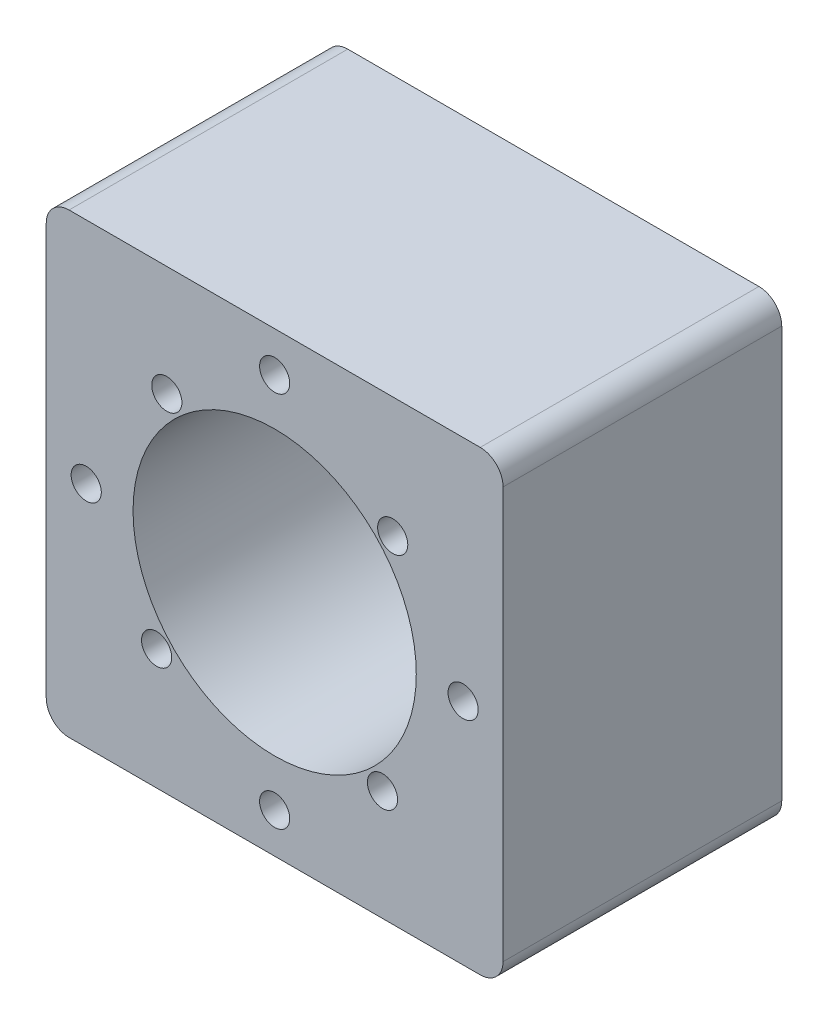
ISO-10303-21;
HEADER;
FILE_DESCRIPTION(('STEP AP214'),'2;1');
FILE_NAME('part.step','',(''),(''),'','','');
FILE_SCHEMA(('AUTOMOTIVE_DESIGN { 1 0 10303 214 1 1 1 1 }'));
ENDSEC;
DATA;
#1=APPLICATION_CONTEXT('core data for automotive mechanical design processes');
#2=APPLICATION_PROTOCOL_DEFINITION('international standard','automotive_design',2000,#1);
#3=PRODUCT_CONTEXT('',#1,'mechanical');
#4=PRODUCT('Part','Part','',(#3));
#5=PRODUCT_RELATED_PRODUCT_CATEGORY('part','',(#4));
#6=PRODUCT_DEFINITION_FORMATION('','',#4);
#7=PRODUCT_DEFINITION_CONTEXT('part definition',#1,'design');
#8=PRODUCT_DEFINITION('design','',#6,#7);
#9=PRODUCT_DEFINITION_SHAPE('','',#8);
#10=(LENGTH_UNIT() NAMED_UNIT(*) SI_UNIT(.MILLI.,.METRE.));
#11=(NAMED_UNIT(*) PLANE_ANGLE_UNIT() SI_UNIT($,.RADIAN.));
#12=(NAMED_UNIT(*) SI_UNIT($,.STERADIAN.) SOLID_ANGLE_UNIT());
#13=UNCERTAINTY_MEASURE_WITH_UNIT(LENGTH_MEASURE(1.E-05),#10,'distance_accuracy_value','');
#14=(GEOMETRIC_REPRESENTATION_CONTEXT(3) GLOBAL_UNCERTAINTY_ASSIGNED_CONTEXT((#13)) GLOBAL_UNIT_ASSIGNED_CONTEXT((#10,
#11,#12)) REPRESENTATION_CONTEXT('',''));
#15=CARTESIAN_POINT('',(0.,0.,0.));
#16=DIRECTION('',(0.,0.,1.));
#17=DIRECTION('',(1.,0.,0.));
#18=AXIS2_PLACEMENT_3D('',#15,#16,#17);
#19=CARTESIAN_POINT('',(0.,0.,7.));
#20=DIRECTION('',(0.,0.,-1.));
#21=DIRECTION('',(-1.,0.,0.));
#22=AXIS2_PLACEMENT_3D('',#19,#20,#21);
#23=CYLINDRICAL_SURFACE('',#22,25.);
#24=CARTESIAN_POINT('',(0.,0.,7.));
#25=DIRECTION('',(0.,0.,-1.));
#26=DIRECTION('',(-1.,0.,0.));
#27=AXIS2_PLACEMENT_3D('',#24,#25,#26);
#28=CIRCLE('',#27,25.);
#29=CARTESIAN_POINT('',(-25.,0.,7.));
#30=VERTEX_POINT('',#29);
#31=EDGE_CURVE('E190',#30,#30,#28,.T.);
#32=ORIENTED_EDGE('',*,*,#31,.F.);
#33=EDGE_LOOP('',(#32));
#34=FACE_BOUND('',#33,.T.);
#35=CARTESIAN_POINT('',(0.,0.,3.));
#36=DIRECTION('',(0.,0.,-1.));
#37=DIRECTION('',(-1.,0.,0.));
#38=AXIS2_PLACEMENT_3D('',#35,#36,#37);
#39=CIRCLE('',#38,25.);
#40=CARTESIAN_POINT('',(-25.,0.,3.));
#41=VERTEX_POINT('',#40);
#42=EDGE_CURVE('E89',#41,#41,#39,.F.);
#43=ORIENTED_EDGE('',*,*,#42,.F.);
#44=EDGE_LOOP('',(#43));
#45=FACE_BOUND('',#44,.T.);
#46=ADVANCED_FACE('F85',(#34,#45),#23,.F.);
#47=CARTESIAN_POINT('',(0.,0.,72.));
#48=DIRECTION('',(0.,0.,-1.));
#49=DIRECTION('',(-1.,0.,0.));
#50=AXIS2_PLACEMENT_3D('',#47,#48,#49);
#51=CYLINDRICAL_SURFACE('',#50,31.);
#52=CARTESIAN_POINT('',(0.,0.,61.));
#53=DIRECTION('',(0.,0.,1.));
#54=DIRECTION('',(1.,0.,0.));
#55=AXIS2_PLACEMENT_3D('',#52,#53,#54);
#56=CIRCLE('',#55,31.);
#57=CARTESIAN_POINT('',(31.,0.,61.));
#58=VERTEX_POINT('',#57);
#59=EDGE_CURVE('E94',#58,#58,#56,.T.);
#60=ORIENTED_EDGE('',*,*,#59,.T.);
#61=EDGE_LOOP('',(#60));
#62=FACE_BOUND('',#61,.T.);
#63=CARTESIAN_POINT('',(0.,0.,7.00000000000001));
#64=DIRECTION('',(0.,0.,-1.));
#65=DIRECTION('',(-1.,0.,0.));
#66=AXIS2_PLACEMENT_3D('',#63,#64,#65);
#67=CIRCLE('',#66,31.);
#68=CARTESIAN_POINT('',(-31.,0.,7.00000000000001));
#69=VERTEX_POINT('',#68);
#70=EDGE_CURVE('E13',#69,#69,#67,.F.);
#71=ORIENTED_EDGE('',*,*,#70,.F.);
#72=EDGE_LOOP('',(#71));
#73=FACE_BOUND('',#72,.T.);
#74=ADVANCED_FACE('F310',(#62,#73),#51,.F.);
#75=CARTESIAN_POINT('',(0.,0.,61.));
#76=DIRECTION('',(0.,0.,1.));
#77=DIRECTION('',(1.,0.,0.));
#78=AXIS2_PLACEMENT_3D('',#75,#76,#77);
#79=PLANE('',#78);
#80=CARTESIAN_POINT('',(-23.6085930044774,25.8386210225883,61.));
#81=DIRECTION('',(0.,0.,1.));
#82=DIRECTION('',(1.,0.,0.));
#83=AXIS2_PLACEMENT_3D('',#80,#81,#82);
#84=CIRCLE('',#83,3.29999999999999);
#85=CARTESIAN_POINT('',(-20.3085930044774,25.8386210225883,61.));
#86=VERTEX_POINT('',#85);
#87=EDGE_CURVE('E229',#86,#86,#84,.T.);
#88=ORIENTED_EDGE('',*,*,#87,.F.);
#89=EDGE_LOOP('',(#88));
#90=FACE_BOUND('',#89,.T.);
#91=CARTESIAN_POINT('',(-25.8386210225883,-23.6085930044774,61.));
#92=DIRECTION('',(0.,0.,1.));
#93=DIRECTION('',(1.,0.,0.));
#94=AXIS2_PLACEMENT_3D('',#91,#92,#93);
#95=CIRCLE('',#94,3.29999999999999);
#96=CARTESIAN_POINT('',(-22.5386210225883,-23.6085930044774,61.));
#97=VERTEX_POINT('',#96);
#98=EDGE_CURVE('E241',#97,#97,#95,.T.);
#99=ORIENTED_EDGE('',*,*,#98,.F.);
#100=EDGE_LOOP('',(#99));
#101=FACE_BOUND('',#100,.T.);
#102=CARTESIAN_POINT('',(23.6085930044774,-25.8386210225883,61.));
#103=DIRECTION('',(0.,0.,1.));
#104=DIRECTION('',(1.,0.,0.));
#105=AXIS2_PLACEMENT_3D('',#102,#103,#104);
#106=CIRCLE('',#105,3.29999999999999);
#107=CARTESIAN_POINT('',(26.9085930044774,-25.8386210225883,61.));
#108=VERTEX_POINT('',#107);
#109=EDGE_CURVE('E247',#108,#108,#106,.T.);
#110=ORIENTED_EDGE('',*,*,#109,.F.);
#111=EDGE_LOOP('',(#110));
#112=FACE_BOUND('',#111,.T.);
#113=CARTESIAN_POINT('',(25.8386210225883,23.6085930044774,61.));
#114=DIRECTION('',(0.,0.,1.));
#115=DIRECTION('',(1.,0.,0.));
#116=AXIS2_PLACEMENT_3D('',#113,#114,#115);
#117=CIRCLE('',#116,3.29999999999999);
#118=CARTESIAN_POINT('',(29.1386210225883,23.6085930044774,61.));
#119=VERTEX_POINT('',#118);
#120=EDGE_CURVE('E253',#119,#119,#117,.T.);
#121=ORIENTED_EDGE('',*,*,#120,.F.);
#122=EDGE_LOOP('',(#121));
#123=FACE_BOUND('',#122,.T.);
#124=CARTESIAN_POINT('',(-41.25,0.,61.));
#125=DIRECTION('',(0.,0.,-1.));
#126=DIRECTION('',(-1.,0.,0.));
#127=AXIS2_PLACEMENT_3D('',#124,#125,#126);
#128=CIRCLE('',#127,3.29999999999998);
#129=CARTESIAN_POINT('',(-44.55,0.,61.));
#130=VERTEX_POINT('',#129);
#131=EDGE_CURVE('E268',#130,#130,#128,.T.);
#132=ORIENTED_EDGE('',*,*,#131,.T.);
#133=EDGE_LOOP('',(#132));
#134=FACE_BOUND('',#133,.T.);
#135=CARTESIAN_POINT('',(0.,41.25,61.));
#136=DIRECTION('',(0.,0.,-1.));
#137=DIRECTION('',(-1.,0.,0.));
#138=AXIS2_PLACEMENT_3D('',#135,#136,#137);
#139=CIRCLE('',#138,3.29999999999998);
#140=CARTESIAN_POINT('',(-3.29999999999998,41.25,61.));
#141=VERTEX_POINT('',#140);
#142=EDGE_CURVE('E280',#141,#141,#139,.T.);
#143=ORIENTED_EDGE('',*,*,#142,.T.);
#144=EDGE_LOOP('',(#143));
#145=FACE_BOUND('',#144,.T.);
#146=CARTESIAN_POINT('',(41.25,0.,61.));
#147=DIRECTION('',(0.,0.,-1.));
#148=DIRECTION('',(-1.,0.,0.));
#149=AXIS2_PLACEMENT_3D('',#146,#147,#148);
#150=CIRCLE('',#149,3.29999999999998);
#151=CARTESIAN_POINT('',(37.95,0.,61.));
#152=VERTEX_POINT('',#151);
#153=EDGE_CURVE('E292',#152,#152,#150,.T.);
#154=ORIENTED_EDGE('',*,*,#153,.T.);
#155=EDGE_LOOP('',(#154));
#156=FACE_BOUND('',#155,.T.);
#157=CARTESIAN_POINT('',(0.,-41.25,61.));
#158=DIRECTION('',(0.,0.,-1.));
#159=DIRECTION('',(-1.,0.,0.));
#160=AXIS2_PLACEMENT_3D('',#157,#158,#159);
#161=CIRCLE('',#160,3.29999999999998);
#162=CARTESIAN_POINT('',(-3.29999999999998,-41.25,61.));
#163=VERTEX_POINT('',#162);
#164=EDGE_CURVE('E304',#163,#163,#161,.T.);
#165=ORIENTED_EDGE('',*,*,#164,.T.);
#166=EDGE_LOOP('',(#165));
#167=FACE_BOUND('',#166,.T.);
#168=ORIENTED_EDGE('',*,*,#59,.F.);
#169=EDGE_LOOP('',(#168));
#170=FACE_BOUND('',#169,.T.);
#171=DIRECTION('',(-1.,0.,0.));
#172=VECTOR('',#171,1.);
#173=CARTESIAN_POINT('',(0.,50.,61.));
#174=LINE('',#173,#172);
#175=CARTESIAN_POINT('',(45.,50.,61.));
#176=VERTEX_POINT('',#175);
#177=CARTESIAN_POINT('',(-45.,50.,61.));
#178=VERTEX_POINT('',#177);
#179=EDGE_CURVE('E227',#176,#178,#174,.T.);
#180=ORIENTED_EDGE('',*,*,#179,.T.);
#181=CARTESIAN_POINT('',(-45.,45.,61.));
#182=DIRECTION('',(0.,0.,1.));
#183=DIRECTION('',(1.,0.,0.));
#184=AXIS2_PLACEMENT_3D('',#181,#182,#183);
#185=CIRCLE('',#184,5.);
#186=CARTESIAN_POINT('',(-50.,45.,61.));
#187=VERTEX_POINT('',#186);
#188=EDGE_CURVE('E214',#187,#178,#185,.F.);
#189=ORIENTED_EDGE('',*,*,#188,.F.);
#190=DIRECTION('',(0.,1.,0.));
#191=VECTOR('',#190,1.);
#192=CARTESIAN_POINT('',(-50.,0.,61.));
#193=LINE('',#192,#191);
#194=CARTESIAN_POINT('',(-50.,-45.,61.));
#195=VERTEX_POINT('',#194);
#196=EDGE_CURVE('E210',#195,#187,#193,.T.);
#197=ORIENTED_EDGE('',*,*,#196,.F.);
#198=CARTESIAN_POINT('',(-45.,-45.,61.));
#199=DIRECTION('',(0.,0.,1.));
#200=DIRECTION('',(1.,0.,0.));
#201=AXIS2_PLACEMENT_3D('',#198,#199,#200);
#202=CIRCLE('',#201,5.);
#203=CARTESIAN_POINT('',(-45.,-50.,61.));
#204=VERTEX_POINT('',#203);
#205=EDGE_CURVE('E200',#204,#195,#202,.F.);
#206=ORIENTED_EDGE('',*,*,#205,.F.);
#207=DIRECTION('',(-1.,0.,0.));
#208=VECTOR('',#207,1.);
#209=CARTESIAN_POINT('',(0.,-50.,61.));
#210=LINE('',#209,#208);
#211=CARTESIAN_POINT('',(45.,-50.,61.));
#212=VERTEX_POINT('',#211);
#213=EDGE_CURVE('E196',#212,#204,#210,.T.);
#214=ORIENTED_EDGE('',*,*,#213,.F.);
#215=CARTESIAN_POINT('',(45.,-45.,61.));
#216=DIRECTION('',(0.,0.,1.));
#217=DIRECTION('',(1.,0.,0.));
#218=AXIS2_PLACEMENT_3D('',#215,#216,#217);
#219=CIRCLE('',#218,5.);
#220=CARTESIAN_POINT('',(50.,-45.,61.));
#221=VERTEX_POINT('',#220);
#222=EDGE_CURVE('E178',#212,#221,#219,.T.);
#223=ORIENTED_EDGE('',*,*,#222,.T.);
#224=DIRECTION('',(0.,1.,0.));
#225=VECTOR('',#224,1.);
#226=CARTESIAN_POINT('',(50.,0.,61.));
#227=LINE('',#226,#225);
#228=CARTESIAN_POINT('',(50.,45.,61.));
#229=VERTEX_POINT('',#228);
#230=EDGE_CURVE('E167',#221,#229,#227,.T.);
#231=ORIENTED_EDGE('',*,*,#230,.T.);
#232=CARTESIAN_POINT('',(45.,45.,61.));
#233=DIRECTION('',(0.,0.,1.));
#234=DIRECTION('',(1.,0.,0.));
#235=AXIS2_PLACEMENT_3D('',#232,#233,#234);
#236=CIRCLE('',#235,5.);
#237=EDGE_CURVE('E230',#229,#176,#236,.T.);
#238=ORIENTED_EDGE('',*,*,#237,.T.);
#239=EDGE_LOOP('',(#180,#189,#197,#206,#214,#223,#231,#238));
#240=FACE_BOUND('',#239,.T.);
#241=ADVANCED_FACE('F313',(#90,#101,#112,#123,#134,#145,#156,#167,#170,#240),#79,.T.);
#242=CARTESIAN_POINT('',(0.,0.,0.));
#243=DIRECTION('',(0.,0.,1.));
#244=DIRECTION('',(1.,0.,0.));
#245=AXIS2_PLACEMENT_3D('',#242,#243,#244);
#246=PLANE('',#245);
#247=CARTESIAN_POINT('',(0.,0.,0.));
#248=DIRECTION('',(0.,0.,-1.));
#249=DIRECTION('',(-1.,0.,0.));
#250=AXIS2_PLACEMENT_3D('',#247,#248,#249);
#251=CIRCLE('',#250,31.);
#252=CARTESIAN_POINT('',(-31.,0.,0.));
#253=VERTEX_POINT('',#252);
#254=EDGE_CURVE('E758',#253,#253,#251,.T.);
#255=ORIENTED_EDGE('',*,*,#254,.F.);
#256=EDGE_LOOP('',(#255));
#257=FACE_BOUND('',#256,.T.);
#258=CARTESIAN_POINT('',(-41.25,0.,0.));
#259=DIRECTION('',(0.,0.,-1.));
#260=DIRECTION('',(-1.,0.,0.));
#261=AXIS2_PLACEMENT_3D('',#258,#259,#260);
#262=CIRCLE('',#261,6.5);
#263=CARTESIAN_POINT('',(-47.75,0.,0.));
#264=VERTEX_POINT('',#263);
#265=EDGE_CURVE('E259',#264,#264,#262,.T.);
#266=ORIENTED_EDGE('',*,*,#265,.F.);
#267=EDGE_LOOP('',(#266));
#268=FACE_BOUND('',#267,.T.);
#269=CARTESIAN_POINT('',(0.,41.25,0.));
#270=DIRECTION('',(0.,0.,-1.));
#271=DIRECTION('',(-1.,0.,0.));
#272=AXIS2_PLACEMENT_3D('',#269,#270,#271);
#273=CIRCLE('',#272,6.5);
#274=CARTESIAN_POINT('',(-6.5,41.25,0.));
#275=VERTEX_POINT('',#274);
#276=EDGE_CURVE('E271',#275,#275,#273,.T.);
#277=ORIENTED_EDGE('',*,*,#276,.F.);
#278=EDGE_LOOP('',(#277));
#279=FACE_BOUND('',#278,.T.);
#280=CARTESIAN_POINT('',(41.25,0.,0.));
#281=DIRECTION('',(0.,0.,-1.));
#282=DIRECTION('',(-1.,0.,0.));
#283=AXIS2_PLACEMENT_3D('',#280,#281,#282);
#284=CIRCLE('',#283,6.5);
#285=CARTESIAN_POINT('',(34.75,0.,0.));
#286=VERTEX_POINT('',#285);
#287=EDGE_CURVE('E283',#286,#286,#284,.T.);
#288=ORIENTED_EDGE('',*,*,#287,.F.);
#289=EDGE_LOOP('',(#288));
#290=FACE_BOUND('',#289,.T.);
#291=CARTESIAN_POINT('',(0.,-41.25,0.));
#292=DIRECTION('',(0.,0.,-1.));
#293=DIRECTION('',(-1.,0.,0.));
#294=AXIS2_PLACEMENT_3D('',#291,#292,#293);
#295=CIRCLE('',#294,6.5);
#296=CARTESIAN_POINT('',(-6.5,-41.25,0.));
#297=VERTEX_POINT('',#296);
#298=EDGE_CURVE('E295',#297,#297,#295,.T.);
#299=ORIENTED_EDGE('',*,*,#298,.F.);
#300=EDGE_LOOP('',(#299));
#301=FACE_BOUND('',#300,.T.);
#302=DIRECTION('',(0.,1.,0.));
#303=VECTOR('',#302,1.);
#304=CARTESIAN_POINT('',(50.,0.,0.));
#305=LINE('',#304,#303);
#306=CARTESIAN_POINT('',(50.,-45.,0.));
#307=VERTEX_POINT('',#306);
#308=CARTESIAN_POINT('',(50.,45.,0.));
#309=VERTEX_POINT('',#308);
#310=EDGE_CURVE('E158',#307,#309,#305,.T.);
#311=ORIENTED_EDGE('',*,*,#310,.F.);
#312=CARTESIAN_POINT('',(45.,-45.,0.));
#313=DIRECTION('',(0.,0.,-1.));
#314=DIRECTION('',(-1.,0.,0.));
#315=AXIS2_PLACEMENT_3D('',#312,#313,#314);
#316=CIRCLE('',#315,5.);
#317=CARTESIAN_POINT('',(45.,-50.,0.));
#318=VERTEX_POINT('',#317);
#319=EDGE_CURVE('E162',#318,#307,#316,.F.);
#320=ORIENTED_EDGE('',*,*,#319,.F.);
#321=DIRECTION('',(-1.,0.,0.));
#322=VECTOR('',#321,1.);
#323=CARTESIAN_POINT('',(0.,-50.,0.));
#324=LINE('',#323,#322);
#325=CARTESIAN_POINT('',(-45.,-50.,0.));
#326=VERTEX_POINT('',#325);
#327=EDGE_CURVE('E183',#318,#326,#324,.T.);
#328=ORIENTED_EDGE('',*,*,#327,.T.);
#329=CARTESIAN_POINT('',(-45.,-45.,0.));
#330=DIRECTION('',(0.,0.,-1.));
#331=DIRECTION('',(-1.,0.,0.));
#332=AXIS2_PLACEMENT_3D('',#329,#330,#331);
#333=CIRCLE('',#332,5.);
#334=CARTESIAN_POINT('',(-50.,-45.,0.));
#335=VERTEX_POINT('',#334);
#336=EDGE_CURVE('E185',#326,#335,#333,.T.);
#337=ORIENTED_EDGE('',*,*,#336,.T.);
#338=DIRECTION('',(0.,1.,0.));
#339=VECTOR('',#338,1.);
#340=CARTESIAN_POINT('',(-50.,0.,0.));
#341=LINE('',#340,#339);
#342=CARTESIAN_POINT('',(-50.,45.,0.));
#343=VERTEX_POINT('',#342);
#344=EDGE_CURVE('E195',#335,#343,#341,.T.);
#345=ORIENTED_EDGE('',*,*,#344,.T.);
#346=CARTESIAN_POINT('',(-45.,45.,0.));
#347=DIRECTION('',(0.,0.,-1.));
#348=DIRECTION('',(-1.,0.,0.));
#349=AXIS2_PLACEMENT_3D('',#346,#347,#348);
#350=CIRCLE('',#349,5.);
#351=CARTESIAN_POINT('',(-45.,50.,0.));
#352=VERTEX_POINT('',#351);
#353=EDGE_CURVE('E219',#343,#352,#350,.T.);
#354=ORIENTED_EDGE('',*,*,#353,.T.);
#355=DIRECTION('',(-1.,0.,0.));
#356=VECTOR('',#355,1.);
#357=CARTESIAN_POINT('',(0.,50.,0.));
#358=LINE('',#357,#356);
#359=CARTESIAN_POINT('',(45.,50.,0.));
#360=VERTEX_POINT('',#359);
#361=EDGE_CURVE('E168',#360,#352,#358,.T.);
#362=ORIENTED_EDGE('',*,*,#361,.F.);
#363=CARTESIAN_POINT('',(45.,45.,0.));
#364=DIRECTION('',(0.,0.,-1.));
#365=DIRECTION('',(-1.,0.,0.));
#366=AXIS2_PLACEMENT_3D('',#363,#364,#365);
#367=CIRCLE('',#366,5.);
#368=EDGE_CURVE('E165',#309,#360,#367,.F.);
#369=ORIENTED_EDGE('',*,*,#368,.F.);
#370=EDGE_LOOP('',(#311,#320,#328,#337,#345,#354,#362,#369));
#371=FACE_BOUND('',#370,.T.);
#372=ADVANCED_FACE('F87',(#257,#268,#279,#290,#301,#371),#246,.F.);
#373=CARTESIAN_POINT('',(0.,-41.25,0.));
#374=DIRECTION('',(0.,0.,-1.));
#375=DIRECTION('',(-1.,0.,0.));
#376=AXIS2_PLACEMENT_3D('',#373,#374,#375);
#377=CYLINDRICAL_SURFACE('',#376,3.29999999999999);
#378=ORIENTED_EDGE('',*,*,#164,.F.);
#379=EDGE_LOOP('',(#378));
#380=FACE_BOUND('',#379,.T.);
#381=CARTESIAN_POINT('',(0.,-41.25,4.6));
#382=DIRECTION('',(0.,0.,-1.));
#383=DIRECTION('',(-1.,0.,0.));
#384=AXIS2_PLACEMENT_3D('',#381,#382,#383);
#385=CIRCLE('',#384,3.3);
#386=CARTESIAN_POINT('',(-3.3,-41.25,4.6));
#387=VERTEX_POINT('',#386);
#388=EDGE_CURVE('E301',#387,#387,#385,.T.);
#389=ORIENTED_EDGE('',*,*,#388,.T.);
#390=EDGE_LOOP('',(#389));
#391=FACE_BOUND('',#390,.T.);
#392=ADVANCED_FACE('F437',(#380,#391),#377,.F.);
#393=CARTESIAN_POINT('',(3.3,-41.25,4.6));
#394=DIRECTION('',(0.,0.,1.));
#395=DIRECTION('',(1.,0.,0.));
#396=AXIS2_PLACEMENT_3D('',#393,#394,#395);
#397=PLANE('',#396);
#398=ORIENTED_EDGE('',*,*,#388,.F.);
#399=EDGE_LOOP('',(#398));
#400=FACE_BOUND('',#399,.T.);
#401=CARTESIAN_POINT('',(0.,-41.25,4.6));
#402=DIRECTION('',(0.,0.,-1.));
#403=DIRECTION('',(-1.,0.,0.));
#404=AXIS2_PLACEMENT_3D('',#401,#402,#403);
#405=CIRCLE('',#404,6.5);
#406=CARTESIAN_POINT('',(-6.5,-41.25,4.6));
#407=VERTEX_POINT('',#406);
#408=EDGE_CURVE('E298',#407,#407,#405,.T.);
#409=ORIENTED_EDGE('',*,*,#408,.T.);
#410=EDGE_LOOP('',(#409));
#411=FACE_BOUND('',#410,.T.);
#412=ADVANCED_FACE('F656',(#400,#411),#397,.F.);
#413=CARTESIAN_POINT('',(0.,-41.25,0.));
#414=DIRECTION('',(0.,0.,-1.));
#415=DIRECTION('',(-1.,0.,0.));
#416=AXIS2_PLACEMENT_3D('',#413,#414,#415);
#417=CYLINDRICAL_SURFACE('',#416,6.5);
#418=ORIENTED_EDGE('',*,*,#408,.F.);
#419=EDGE_LOOP('',(#418));
#420=FACE_BOUND('',#419,.T.);
#421=ORIENTED_EDGE('',*,*,#298,.T.);
#422=EDGE_LOOP('',(#421));
#423=FACE_BOUND('',#422,.T.);
#424=ADVANCED_FACE('F646',(#420,#423),#417,.F.);
#425=CARTESIAN_POINT('',(41.25,0.,0.));
#426=DIRECTION('',(0.,0.,-1.));
#427=DIRECTION('',(-1.,0.,0.));
#428=AXIS2_PLACEMENT_3D('',#425,#426,#427);
#429=CYLINDRICAL_SURFACE('',#428,3.29999999999999);
#430=ORIENTED_EDGE('',*,*,#153,.F.);
#431=EDGE_LOOP('',(#430));
#432=FACE_BOUND('',#431,.T.);
#433=CARTESIAN_POINT('',(41.25,0.,4.6));
#434=DIRECTION('',(0.,0.,-1.));
#435=DIRECTION('',(-1.,0.,0.));
#436=AXIS2_PLACEMENT_3D('',#433,#434,#435);
#437=CIRCLE('',#436,3.3);
#438=CARTESIAN_POINT('',(37.95,0.,4.6));
#439=VERTEX_POINT('',#438);
#440=EDGE_CURVE('E289',#439,#439,#437,.T.);
#441=ORIENTED_EDGE('',*,*,#440,.T.);
#442=EDGE_LOOP('',(#441));
#443=FACE_BOUND('',#442,.T.);
#444=ADVANCED_FACE('F636',(#432,#443),#429,.F.);
#445=CARTESIAN_POINT('',(44.55,0.,4.6));
#446=DIRECTION('',(0.,0.,1.));
#447=DIRECTION('',(1.,0.,0.));
#448=AXIS2_PLACEMENT_3D('',#445,#446,#447);
#449=PLANE('',#448);
#450=ORIENTED_EDGE('',*,*,#440,.F.);
#451=EDGE_LOOP('',(#450));
#452=FACE_BOUND('',#451,.T.);
#453=CARTESIAN_POINT('',(41.25,0.,4.6));
#454=DIRECTION('',(0.,0.,-1.));
#455=DIRECTION('',(-1.,0.,0.));
#456=AXIS2_PLACEMENT_3D('',#453,#454,#455);
#457=CIRCLE('',#456,6.5);
#458=CARTESIAN_POINT('',(34.75,0.,4.6));
#459=VERTEX_POINT('',#458);
#460=EDGE_CURVE('E286',#459,#459,#457,.T.);
#461=ORIENTED_EDGE('',*,*,#460,.T.);
#462=EDGE_LOOP('',(#461));
#463=FACE_BOUND('',#462,.T.);
#464=ADVANCED_FACE('F626',(#452,#463),#449,.F.);
#465=CARTESIAN_POINT('',(41.25,0.,0.));
#466=DIRECTION('',(0.,0.,-1.));
#467=DIRECTION('',(-1.,0.,0.));
#468=AXIS2_PLACEMENT_3D('',#465,#466,#467);
#469=CYLINDRICAL_SURFACE('',#468,6.5);
#470=ORIENTED_EDGE('',*,*,#460,.F.);
#471=EDGE_LOOP('',(#470));
#472=FACE_BOUND('',#471,.T.);
#473=ORIENTED_EDGE('',*,*,#287,.T.);
#474=EDGE_LOOP('',(#473));
#475=FACE_BOUND('',#474,.T.);
#476=ADVANCED_FACE('F616',(#472,#475),#469,.F.);
#477=CARTESIAN_POINT('',(0.,41.25,0.));
#478=DIRECTION('',(0.,0.,-1.));
#479=DIRECTION('',(-1.,0.,0.));
#480=AXIS2_PLACEMENT_3D('',#477,#478,#479);
#481=CYLINDRICAL_SURFACE('',#480,3.29999999999999);
#482=ORIENTED_EDGE('',*,*,#142,.F.);
#483=EDGE_LOOP('',(#482));
#484=FACE_BOUND('',#483,.T.);
#485=CARTESIAN_POINT('',(0.,41.25,4.6));
#486=DIRECTION('',(0.,0.,-1.));
#487=DIRECTION('',(-1.,0.,0.));
#488=AXIS2_PLACEMENT_3D('',#485,#486,#487);
#489=CIRCLE('',#488,3.3);
#490=CARTESIAN_POINT('',(-3.3,41.25,4.6));
#491=VERTEX_POINT('',#490);
#492=EDGE_CURVE('E277',#491,#491,#489,.T.);
#493=ORIENTED_EDGE('',*,*,#492,.T.);
#494=EDGE_LOOP('',(#493));
#495=FACE_BOUND('',#494,.T.);
#496=ADVANCED_FACE('F606',(#484,#495),#481,.F.);
#497=CARTESIAN_POINT('',(3.3,41.25,4.6));
#498=DIRECTION('',(0.,0.,1.));
#499=DIRECTION('',(1.,0.,0.));
#500=AXIS2_PLACEMENT_3D('',#497,#498,#499);
#501=PLANE('',#500);
#502=ORIENTED_EDGE('',*,*,#492,.F.);
#503=EDGE_LOOP('',(#502));
#504=FACE_BOUND('',#503,.T.);
#505=CARTESIAN_POINT('',(0.,41.25,4.6));
#506=DIRECTION('',(0.,0.,-1.));
#507=DIRECTION('',(-1.,0.,0.));
#508=AXIS2_PLACEMENT_3D('',#505,#506,#507);
#509=CIRCLE('',#508,6.5);
#510=CARTESIAN_POINT('',(-6.5,41.25,4.6));
#511=VERTEX_POINT('',#510);
#512=EDGE_CURVE('E274',#511,#511,#509,.T.);
#513=ORIENTED_EDGE('',*,*,#512,.T.);
#514=EDGE_LOOP('',(#513));
#515=FACE_BOUND('',#514,.T.);
#516=ADVANCED_FACE('F596',(#504,#515),#501,.F.);
#517=CARTESIAN_POINT('',(0.,41.25,0.));
#518=DIRECTION('',(0.,0.,-1.));
#519=DIRECTION('',(-1.,0.,0.));
#520=AXIS2_PLACEMENT_3D('',#517,#518,#519);
#521=CYLINDRICAL_SURFACE('',#520,6.5);
#522=ORIENTED_EDGE('',*,*,#512,.F.);
#523=EDGE_LOOP('',(#522));
#524=FACE_BOUND('',#523,.T.);
#525=ORIENTED_EDGE('',*,*,#276,.T.);
#526=EDGE_LOOP('',(#525));
#527=FACE_BOUND('',#526,.T.);
#528=ADVANCED_FACE('F586',(#524,#527),#521,.F.);
#529=CARTESIAN_POINT('',(-41.25,0.,0.));
#530=DIRECTION('',(0.,0.,-1.));
#531=DIRECTION('',(-1.,0.,0.));
#532=AXIS2_PLACEMENT_3D('',#529,#530,#531);
#533=CYLINDRICAL_SURFACE('',#532,3.29999999999999);
#534=ORIENTED_EDGE('',*,*,#131,.F.);
#535=EDGE_LOOP('',(#534));
#536=FACE_BOUND('',#535,.T.);
#537=CARTESIAN_POINT('',(-41.25,0.,4.6));
#538=DIRECTION('',(0.,0.,-1.));
#539=DIRECTION('',(-1.,0.,0.));
#540=AXIS2_PLACEMENT_3D('',#537,#538,#539);
#541=CIRCLE('',#540,3.3);
#542=CARTESIAN_POINT('',(-44.55,0.,4.6));
#543=VERTEX_POINT('',#542);
#544=EDGE_CURVE('E265',#543,#543,#541,.T.);
#545=ORIENTED_EDGE('',*,*,#544,.T.);
#546=EDGE_LOOP('',(#545));
#547=FACE_BOUND('',#546,.T.);
#548=ADVANCED_FACE('F576',(#536,#547),#533,.F.);
#549=CARTESIAN_POINT('',(-37.95,0.,4.6));
#550=DIRECTION('',(0.,0.,1.));
#551=DIRECTION('',(1.,0.,0.));
#552=AXIS2_PLACEMENT_3D('',#549,#550,#551);
#553=PLANE('',#552);
#554=ORIENTED_EDGE('',*,*,#544,.F.);
#555=EDGE_LOOP('',(#554));
#556=FACE_BOUND('',#555,.T.);
#557=CARTESIAN_POINT('',(-41.25,0.,4.6));
#558=DIRECTION('',(0.,0.,-1.));
#559=DIRECTION('',(-1.,0.,0.));
#560=AXIS2_PLACEMENT_3D('',#557,#558,#559);
#561=CIRCLE('',#560,6.5);
#562=CARTESIAN_POINT('',(-47.75,0.,4.6));
#563=VERTEX_POINT('',#562);
#564=EDGE_CURVE('E262',#563,#563,#561,.T.);
#565=ORIENTED_EDGE('',*,*,#564,.T.);
#566=EDGE_LOOP('',(#565));
#567=FACE_BOUND('',#566,.T.);
#568=ADVANCED_FACE('F566',(#556,#567),#553,.F.);
#569=CARTESIAN_POINT('',(-41.25,0.,0.));
#570=DIRECTION('',(0.,0.,-1.));
#571=DIRECTION('',(-1.,0.,0.));
#572=AXIS2_PLACEMENT_3D('',#569,#570,#571);
#573=CYLINDRICAL_SURFACE('',#572,6.5);
#574=ORIENTED_EDGE('',*,*,#564,.F.);
#575=EDGE_LOOP('',(#574));
#576=FACE_BOUND('',#575,.T.);
#577=ORIENTED_EDGE('',*,*,#265,.T.);
#578=EDGE_LOOP('',(#577));
#579=FACE_BOUND('',#578,.T.);
#580=ADVANCED_FACE('F557',(#576,#579),#573,.F.);
#581=CARTESIAN_POINT('',(25.8386210225883,23.6085930044774,56.));
#582=DIRECTION('',(0.,0.,1.));
#583=DIRECTION('',(1.,0.,0.));
#584=AXIS2_PLACEMENT_3D('',#581,#582,#583);
#585=CONICAL_SURFACE('',#584,3.29999999999999,1.0471975511966);
#586=CARTESIAN_POINT('',(25.8386210225883,23.6085930044774,54.0947441116742));
#587=VERTEX_POINT('',#586);
#588=VERTEX_LOOP('',#587);
#589=FACE_BOUND('',#588,.T.);
#590=CARTESIAN_POINT('',(25.8386210225883,23.6085930044774,56.));
#591=DIRECTION('',(0.,0.,1.));
#592=DIRECTION('',(1.,0.,0.));
#593=AXIS2_PLACEMENT_3D('',#590,#591,#592);
#594=CIRCLE('',#593,3.29999999999999);
#595=CARTESIAN_POINT('',(29.1386210225883,23.6085930044774,56.));
#596=VERTEX_POINT('',#595);
#597=EDGE_CURVE('E256',#596,#596,#594,.T.);
#598=ORIENTED_EDGE('',*,*,#597,.T.);
#599=EDGE_LOOP('',(#598));
#600=FACE_BOUND('',#599,.T.);
#601=ADVANCED_FACE('F547',(#589,#600),#585,.F.);
#602=CARTESIAN_POINT('',(25.8386210225883,23.6085930044774,61.));
#603=DIRECTION('',(0.,0.,1.));
#604=DIRECTION('',(1.,0.,0.));
#605=AXIS2_PLACEMENT_3D('',#602,#603,#604);
#606=CYLINDRICAL_SURFACE('',#605,3.29999999999999);
#607=ORIENTED_EDGE('',*,*,#597,.F.);
#608=EDGE_LOOP('',(#607));
#609=FACE_BOUND('',#608,.T.);
#610=ORIENTED_EDGE('',*,*,#120,.T.);
#611=EDGE_LOOP('',(#610));
#612=FACE_BOUND('',#611,.T.);
#613=ADVANCED_FACE('F538',(#609,#612),#606,.F.);
#614=CARTESIAN_POINT('',(23.6085930044774,-25.8386210225883,56.));
#615=DIRECTION('',(0.,0.,1.));
#616=DIRECTION('',(1.,0.,0.));
#617=AXIS2_PLACEMENT_3D('',#614,#615,#616);
#618=CONICAL_SURFACE('',#617,3.29999999999999,1.0471975511966);
#619=CARTESIAN_POINT('',(23.6085930044774,-25.8386210225883,54.0947441116742));
#620=VERTEX_POINT('',#619);
#621=VERTEX_LOOP('',#620);
#622=FACE_BOUND('',#621,.T.);
#623=CARTESIAN_POINT('',(23.6085930044774,-25.8386210225883,56.));
#624=DIRECTION('',(0.,0.,1.));
#625=DIRECTION('',(1.,0.,0.));
#626=AXIS2_PLACEMENT_3D('',#623,#624,#625);
#627=CIRCLE('',#626,3.29999999999999);
#628=CARTESIAN_POINT('',(26.9085930044774,-25.8386210225883,56.));
#629=VERTEX_POINT('',#628);
#630=EDGE_CURVE('E250',#629,#629,#627,.T.);
#631=ORIENTED_EDGE('',*,*,#630,.T.);
#632=EDGE_LOOP('',(#631));
#633=FACE_BOUND('',#632,.T.);
#634=ADVANCED_FACE('F528',(#622,#633),#618,.F.);
#635=CARTESIAN_POINT('',(23.6085930044774,-25.8386210225883,61.));
#636=DIRECTION('',(0.,0.,1.));
#637=DIRECTION('',(1.,0.,0.));
#638=AXIS2_PLACEMENT_3D('',#635,#636,#637);
#639=CYLINDRICAL_SURFACE('',#638,3.29999999999999);
#640=ORIENTED_EDGE('',*,*,#630,.F.);
#641=EDGE_LOOP('',(#640));
#642=FACE_BOUND('',#641,.T.);
#643=ORIENTED_EDGE('',*,*,#109,.T.);
#644=EDGE_LOOP('',(#643));
#645=FACE_BOUND('',#644,.T.);
#646=ADVANCED_FACE('F518',(#642,#645),#639,.F.);
#647=CARTESIAN_POINT('',(-25.8386210225883,-23.6085930044774,56.));
#648=DIRECTION('',(0.,0.,1.));
#649=DIRECTION('',(1.,0.,0.));
#650=AXIS2_PLACEMENT_3D('',#647,#648,#649);
#651=CONICAL_SURFACE('',#650,3.29999999999999,1.0471975511966);
#652=CARTESIAN_POINT('',(-25.8386210225883,-23.6085930044774,54.0947441116742));
#653=VERTEX_POINT('',#652);
#654=VERTEX_LOOP('',#653);
#655=FACE_BOUND('',#654,.T.);
#656=CARTESIAN_POINT('',(-25.8386210225883,-23.6085930044774,56.));
#657=DIRECTION('',(0.,0.,1.));
#658=DIRECTION('',(1.,0.,0.));
#659=AXIS2_PLACEMENT_3D('',#656,#657,#658);
#660=CIRCLE('',#659,3.29999999999999);
#661=CARTESIAN_POINT('',(-22.5386210225883,-23.6085930044774,56.));
#662=VERTEX_POINT('',#661);
#663=EDGE_CURVE('E244',#662,#662,#660,.T.);
#664=ORIENTED_EDGE('',*,*,#663,.T.);
#665=EDGE_LOOP('',(#664));
#666=FACE_BOUND('',#665,.T.);
#667=ADVANCED_FACE('F508',(#655,#666),#651,.F.);
#668=CARTESIAN_POINT('',(-25.8386210225883,-23.6085930044774,61.));
#669=DIRECTION('',(0.,0.,1.));
#670=DIRECTION('',(1.,0.,0.));
#671=AXIS2_PLACEMENT_3D('',#668,#669,#670);
#672=CYLINDRICAL_SURFACE('',#671,3.29999999999999);
#673=ORIENTED_EDGE('',*,*,#663,.F.);
#674=EDGE_LOOP('',(#673));
#675=FACE_BOUND('',#674,.T.);
#676=ORIENTED_EDGE('',*,*,#98,.T.);
#677=EDGE_LOOP('',(#676));
#678=FACE_BOUND('',#677,.T.);
#679=ADVANCED_FACE('F498',(#675,#678),#672,.F.);
#680=CARTESIAN_POINT('',(-23.6085930044774,25.8386210225883,56.));
#681=DIRECTION('',(0.,0.,1.));
#682=DIRECTION('',(1.,0.,0.));
#683=AXIS2_PLACEMENT_3D('',#680,#681,#682);
#684=CONICAL_SURFACE('',#683,3.29999999999999,1.0471975511966);
#685=CARTESIAN_POINT('',(-23.6085930044774,25.8386210225883,54.0947441116742));
#686=VERTEX_POINT('',#685);
#687=VERTEX_LOOP('',#686);
#688=FACE_BOUND('',#687,.T.);
#689=CARTESIAN_POINT('',(-23.6085930044774,25.8386210225883,56.));
#690=DIRECTION('',(0.,0.,1.));
#691=DIRECTION('',(1.,0.,0.));
#692=AXIS2_PLACEMENT_3D('',#689,#690,#691);
#693=CIRCLE('',#692,3.29999999999999);
#694=CARTESIAN_POINT('',(-20.3085930044774,25.8386210225883,56.));
#695=VERTEX_POINT('',#694);
#696=EDGE_CURVE('E238',#695,#695,#693,.T.);
#697=ORIENTED_EDGE('',*,*,#696,.T.);
#698=EDGE_LOOP('',(#697));
#699=FACE_BOUND('',#698,.T.);
#700=ADVANCED_FACE('F345',(#688,#699),#684,.F.);
#701=CARTESIAN_POINT('',(-23.6085930044774,25.8386210225883,61.));
#702=DIRECTION('',(0.,0.,1.));
#703=DIRECTION('',(1.,0.,0.));
#704=AXIS2_PLACEMENT_3D('',#701,#702,#703);
#705=CYLINDRICAL_SURFACE('',#704,3.29999999999999);
#706=ORIENTED_EDGE('',*,*,#696,.F.);
#707=EDGE_LOOP('',(#706));
#708=FACE_BOUND('',#707,.T.);
#709=ORIENTED_EDGE('',*,*,#87,.T.);
#710=EDGE_LOOP('',(#709));
#711=FACE_BOUND('',#710,.T.);
#712=ADVANCED_FACE('F338',(#708,#711),#705,.F.);
#713=CARTESIAN_POINT('',(45.,45.,192.710678118655));
#714=DIRECTION('',(0.,0.,-1.));
#715=DIRECTION('',(-1.,0.,0.));
#716=AXIS2_PLACEMENT_3D('',#713,#714,#715);
#717=CYLINDRICAL_SURFACE('',#716,5.);
#718=ORIENTED_EDGE('',*,*,#237,.F.);
#719=DIRECTION('',(0.,0.,-1.));
#720=VECTOR('',#719,1.);
#721=CARTESIAN_POINT('',(50.,45.,192.710678118655));
#722=LINE('',#721,#720);
#723=EDGE_CURVE('E209',#229,#309,#722,.T.);
#724=ORIENTED_EDGE('',*,*,#723,.T.);
#725=ORIENTED_EDGE('',*,*,#368,.T.);
#726=DIRECTION('',(0.,0.,-1.));
#727=VECTOR('',#726,1.);
#728=CARTESIAN_POINT('',(45.,50.,192.710678118655));
#729=LINE('',#728,#727);
#730=EDGE_CURVE('E224',#176,#360,#729,.T.);
#731=ORIENTED_EDGE('',*,*,#730,.F.);
#732=EDGE_LOOP('',(#718,#724,#725,#731));
#733=FACE_BOUND('',#732,.T.);
#734=ADVANCED_FACE('F336',(#733),#717,.T.);
#735=CARTESIAN_POINT('',(0.,50.,192.710678118655));
#736=DIRECTION('',(0.,-1.,0.));
#737=DIRECTION('',(0.,0.,-1.));
#738=AXIS2_PLACEMENT_3D('',#735,#736,#737);
#739=PLANE('',#738);
#740=ORIENTED_EDGE('',*,*,#179,.F.);
#741=ORIENTED_EDGE('',*,*,#730,.T.);
#742=ORIENTED_EDGE('',*,*,#361,.T.);
#743=DIRECTION('',(0.,0.,-1.));
#744=VECTOR('',#743,1.);
#745=CARTESIAN_POINT('',(-45.,50.,192.710678118655));
#746=LINE('',#745,#744);
#747=EDGE_CURVE('E211',#178,#352,#746,.T.);
#748=ORIENTED_EDGE('',*,*,#747,.F.);
#749=EDGE_LOOP('',(#740,#741,#742,#748));
#750=FACE_BOUND('',#749,.T.);
#751=ADVANCED_FACE('F321',(#750),#739,.F.);
#752=CARTESIAN_POINT('',(50.,0.,192.710678118655));
#753=DIRECTION('',(-1.,0.,0.));
#754=DIRECTION('',(0.,0.,1.));
#755=AXIS2_PLACEMENT_3D('',#752,#753,#754);
#756=PLANE('',#755);
#757=ORIENTED_EDGE('',*,*,#230,.F.);
#758=DIRECTION('',(0.,0.,-1.));
#759=VECTOR('',#758,1.);
#760=CARTESIAN_POINT('',(50.,-45.,192.710678118655));
#761=LINE('',#760,#759);
#762=EDGE_CURVE('E171',#221,#307,#761,.T.);
#763=ORIENTED_EDGE('',*,*,#762,.T.);
#764=ORIENTED_EDGE('',*,*,#310,.T.);
#765=ORIENTED_EDGE('',*,*,#723,.F.);
#766=EDGE_LOOP('',(#757,#763,#764,#765));
#767=FACE_BOUND('',#766,.T.);
#768=ADVANCED_FACE('F172',(#767),#756,.F.);
#769=CARTESIAN_POINT('',(-45.,45.,192.710678118655));
#770=DIRECTION('',(0.,0.,-1.));
#771=DIRECTION('',(-1.,0.,0.));
#772=AXIS2_PLACEMENT_3D('',#769,#770,#771);
#773=CYLINDRICAL_SURFACE('',#772,5.);
#774=DIRECTION('',(0.,0.,-1.));
#775=VECTOR('',#774,1.);
#776=CARTESIAN_POINT('',(-50.,45.,192.710678118655));
#777=LINE('',#776,#775);
#778=EDGE_CURVE('E207',#187,#343,#777,.T.);
#779=ORIENTED_EDGE('',*,*,#778,.F.);
#780=ORIENTED_EDGE('',*,*,#188,.T.);
#781=ORIENTED_EDGE('',*,*,#747,.T.);
#782=ORIENTED_EDGE('',*,*,#353,.F.);
#783=EDGE_LOOP('',(#779,#780,#781,#782));
#784=FACE_BOUND('',#783,.T.);
#785=ADVANCED_FACE('F325',(#784),#773,.T.);
#786=CARTESIAN_POINT('',(-50.,0.,192.710678118655));
#787=DIRECTION('',(-1.,0.,0.));
#788=DIRECTION('',(0.,0.,1.));
#789=AXIS2_PLACEMENT_3D('',#786,#787,#788);
#790=PLANE('',#789);
#791=ORIENTED_EDGE('',*,*,#344,.F.);
#792=DIRECTION('',(0.,0.,-1.));
#793=VECTOR('',#792,1.);
#794=CARTESIAN_POINT('',(-50.,-45.,192.710678118655));
#795=LINE('',#794,#793);
#796=EDGE_CURVE('E197',#195,#335,#795,.T.);
#797=ORIENTED_EDGE('',*,*,#796,.F.);
#798=ORIENTED_EDGE('',*,*,#196,.T.);
#799=ORIENTED_EDGE('',*,*,#778,.T.);
#800=EDGE_LOOP('',(#791,#797,#798,#799));
#801=FACE_BOUND('',#800,.T.);
#802=ADVANCED_FACE('F327',(#801),#790,.T.);
#803=CARTESIAN_POINT('',(-45.,-45.,192.710678118655));
#804=DIRECTION('',(0.,0.,-1.));
#805=DIRECTION('',(-1.,0.,0.));
#806=AXIS2_PLACEMENT_3D('',#803,#804,#805);
#807=CYLINDRICAL_SURFACE('',#806,5.);
#808=DIRECTION('',(0.,0.,-1.));
#809=VECTOR('',#808,1.);
#810=CARTESIAN_POINT('',(-45.,-50.,192.710678118655));
#811=LINE('',#810,#809);
#812=EDGE_CURVE('E193',#204,#326,#811,.T.);
#813=ORIENTED_EDGE('',*,*,#812,.F.);
#814=ORIENTED_EDGE('',*,*,#205,.T.);
#815=ORIENTED_EDGE('',*,*,#796,.T.);
#816=ORIENTED_EDGE('',*,*,#336,.F.);
#817=EDGE_LOOP('',(#813,#814,#815,#816));
#818=FACE_BOUND('',#817,.T.);
#819=ADVANCED_FACE('F334',(#818),#807,.T.);
#820=CARTESIAN_POINT('',(0.,-50.,192.710678118655));
#821=DIRECTION('',(0.,-1.,0.));
#822=DIRECTION('',(0.,0.,-1.));
#823=AXIS2_PLACEMENT_3D('',#820,#821,#822);
#824=PLANE('',#823);
#825=ORIENTED_EDGE('',*,*,#327,.F.);
#826=DIRECTION('',(0.,0.,-1.));
#827=VECTOR('',#826,1.);
#828=CARTESIAN_POINT('',(45.,-50.,192.710678118655));
#829=LINE('',#828,#827);
#830=EDGE_CURVE('E177',#212,#318,#829,.T.);
#831=ORIENTED_EDGE('',*,*,#830,.F.);
#832=ORIENTED_EDGE('',*,*,#213,.T.);
#833=ORIENTED_EDGE('',*,*,#812,.T.);
#834=EDGE_LOOP('',(#825,#831,#832,#833));
#835=FACE_BOUND('',#834,.T.);
#836=ADVANCED_FACE('F332',(#835),#824,.T.);
#837=CARTESIAN_POINT('',(45.,-45.,192.710678118655));
#838=DIRECTION('',(0.,0.,-1.));
#839=DIRECTION('',(-1.,0.,0.));
#840=AXIS2_PLACEMENT_3D('',#837,#838,#839);
#841=CYLINDRICAL_SURFACE('',#840,5.);
#842=ORIENTED_EDGE('',*,*,#222,.F.);
#843=ORIENTED_EDGE('',*,*,#830,.T.);
#844=ORIENTED_EDGE('',*,*,#319,.T.);
#845=ORIENTED_EDGE('',*,*,#762,.F.);
#846=EDGE_LOOP('',(#842,#843,#844,#845));
#847=FACE_BOUND('',#846,.T.);
#848=ADVANCED_FACE('F181',(#847),#841,.T.);
#849=CARTESIAN_POINT('',(0.,0.,7.));
#850=DIRECTION('',(0.,0.,-1.));
#851=DIRECTION('',(-1.,0.,0.));
#852=AXIS2_PLACEMENT_3D('',#849,#850,#851);
#853=PLANE('',#852);
#854=ORIENTED_EDGE('',*,*,#31,.T.);
#855=EDGE_LOOP('',(#854));
#856=FACE_BOUND('',#855,.T.);
#857=ORIENTED_EDGE('',*,*,#70,.T.);
#858=EDGE_LOOP('',(#857));
#859=FACE_BOUND('',#858,.T.);
#860=ADVANCED_FACE('F361',(#856,#859),#853,.F.);
#861=CARTESIAN_POINT('',(0.,0.,3.));
#862=DIRECTION('',(0.,0.,-1.));
#863=DIRECTION('',(-1.,0.,0.));
#864=AXIS2_PLACEMENT_3D('',#861,#862,#863);
#865=PLANE('',#864);
#866=CARTESIAN_POINT('',(0.,0.,3.));
#867=DIRECTION('',(0.,0.,-1.));
#868=DIRECTION('',(-1.,0.,0.));
#869=AXIS2_PLACEMENT_3D('',#866,#867,#868);
#870=CIRCLE('',#869,31.);
#871=CARTESIAN_POINT('',(-31.,0.,3.));
#872=VERTEX_POINT('',#871);
#873=EDGE_CURVE('E760',#872,#872,#870,.T.);
#874=ORIENTED_EDGE('',*,*,#873,.T.);
#875=EDGE_LOOP('',(#874));
#876=FACE_BOUND('',#875,.T.);
#877=ORIENTED_EDGE('',*,*,#42,.T.);
#878=EDGE_LOOP('',(#877));
#879=FACE_BOUND('',#878,.T.);
#880=ADVANCED_FACE('F364',(#876,#879),#865,.T.);
#881=CARTESIAN_POINT('',(0.,0.,3.));
#882=DIRECTION('',(0.,0.,-1.));
#883=DIRECTION('',(-1.,0.,0.));
#884=AXIS2_PLACEMENT_3D('',#881,#882,#883);
#885=CYLINDRICAL_SURFACE('',#884,31.);
#886=ORIENTED_EDGE('',*,*,#873,.F.);
#887=EDGE_LOOP('',(#886));
#888=FACE_BOUND('',#887,.T.);
#889=ORIENTED_EDGE('',*,*,#254,.T.);
#890=EDGE_LOOP('',(#889));
#891=FACE_BOUND('',#890,.T.);
#892=ADVANCED_FACE('F359',(#888,#891),#885,.F.);
#893=CLOSED_SHELL('',(#46,#74,#241,#372,#392,#412,#424,#444,#464,#476,#496,#516,#528,#548,#568,
#580,#601,#613,#634,#646,#667,#679,#700,#712,#734,#751,#768,#785,#802,#819,#836,#848,#860,#880,#892));
#894=MANIFOLD_SOLID_BREP('B2',#893);
#895=ADVANCED_BREP_SHAPE_REPRESENTATION('',(#18,#894),#14);
#896=SHAPE_DEFINITION_REPRESENTATION(#9,#895);
ENDSEC;
END-ISO-10303-21;
